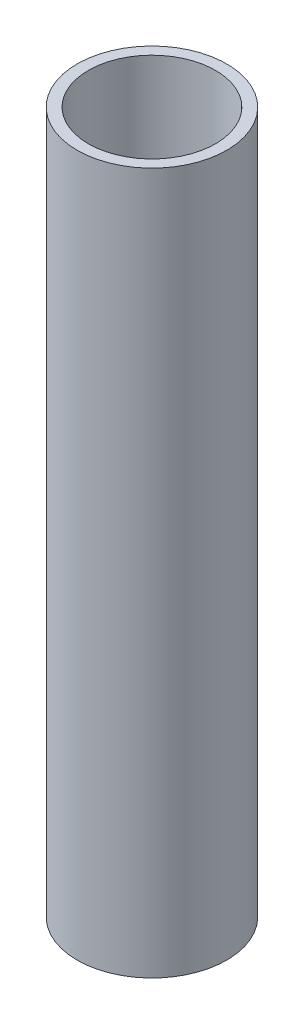
ISO-10303-21;
HEADER;
FILE_DESCRIPTION(('STEP AP214'),'2;1');
FILE_NAME('part.step','',(''),(''),'','','');
FILE_SCHEMA(('AUTOMOTIVE_DESIGN { 1 0 10303 214 1 1 1 1 }'));
ENDSEC;
DATA;
#1=APPLICATION_CONTEXT('core data for automotive mechanical design processes');
#2=APPLICATION_PROTOCOL_DEFINITION('international standard','automotive_design',2000,#1);
#3=PRODUCT_CONTEXT('',#1,'mechanical');
#4=PRODUCT('Part','Part','',(#3));
#5=PRODUCT_RELATED_PRODUCT_CATEGORY('part','',(#4));
#6=PRODUCT_DEFINITION_FORMATION('','',#4);
#7=PRODUCT_DEFINITION_CONTEXT('part definition',#1,'design');
#8=PRODUCT_DEFINITION('design','',#6,#7);
#9=PRODUCT_DEFINITION_SHAPE('','',#8);
#10=(LENGTH_UNIT() NAMED_UNIT(*) SI_UNIT(.MILLI.,.METRE.));
#11=(NAMED_UNIT(*) PLANE_ANGLE_UNIT() SI_UNIT($,.RADIAN.));
#12=(NAMED_UNIT(*) SI_UNIT($,.STERADIAN.) SOLID_ANGLE_UNIT());
#13=UNCERTAINTY_MEASURE_WITH_UNIT(LENGTH_MEASURE(1.E-05),#10,'distance_accuracy_value','');
#14=(GEOMETRIC_REPRESENTATION_CONTEXT(3) GLOBAL_UNCERTAINTY_ASSIGNED_CONTEXT((#13)) GLOBAL_UNIT_ASSIGNED_CONTEXT((#10,
#11,#12)) REPRESENTATION_CONTEXT('',''));
#15=CARTESIAN_POINT('',(0.,0.,0.));
#16=DIRECTION('',(0.,0.,1.));
#17=DIRECTION('',(1.,0.,0.));
#18=AXIS2_PLACEMENT_3D('',#15,#16,#17);
#19=CARTESIAN_POINT('',(0.,150.,0.));
#20=DIRECTION('',(0.,1.,0.));
#21=DIRECTION('',(0.,0.,1.));
#22=AXIS2_PLACEMENT_3D('',#19,#20,#21);
#23=PLANE('',#22);
#24=CARTESIAN_POINT('',(0.,150.,0.));
#25=DIRECTION('',(0.,1.,0.));
#26=DIRECTION('',(0.,0.,1.));
#27=AXIS2_PLACEMENT_3D('',#24,#25,#26);
#28=CIRCLE('',#27,16.);
#29=CARTESIAN_POINT('',(0.,150.,16.));
#30=VERTEX_POINT('',#29);
#31=EDGE_CURVE('E10',#30,#30,#28,.T.);
#32=ORIENTED_EDGE('',*,*,#31,.T.);
#33=EDGE_LOOP('',(#32));
#34=FACE_BOUND('',#33,.T.);
#35=CARTESIAN_POINT('',(0.,150.,0.));
#36=DIRECTION('',(0.,1.,0.));
#37=DIRECTION('',(0.,0.,1.));
#38=AXIS2_PLACEMENT_3D('',#35,#36,#37);
#39=CIRCLE('',#38,13.6);
#40=CARTESIAN_POINT('',(0.,150.,13.6));
#41=VERTEX_POINT('',#40);
#42=EDGE_CURVE('E50',#41,#41,#39,.T.);
#43=ORIENTED_EDGE('',*,*,#42,.F.);
#44=EDGE_LOOP('',(#43));
#45=FACE_BOUND('',#44,.T.);
#46=ADVANCED_FACE('F39',(#34,#45),#23,.T.);
#47=CARTESIAN_POINT('',(0.,0.,0.));
#48=DIRECTION('',(0.,1.,0.));
#49=DIRECTION('',(0.,0.,1.));
#50=AXIS2_PLACEMENT_3D('',#47,#48,#49);
#51=PLANE('',#50);
#52=CARTESIAN_POINT('',(0.,0.,0.));
#53=DIRECTION('',(0.,1.,0.));
#54=DIRECTION('',(0.,0.,1.));
#55=AXIS2_PLACEMENT_3D('',#52,#53,#54);
#56=CIRCLE('',#55,16.);
#57=CARTESIAN_POINT('',(0.,0.,16.));
#58=VERTEX_POINT('',#57);
#59=EDGE_CURVE('E43',#58,#58,#56,.T.);
#60=ORIENTED_EDGE('',*,*,#59,.F.);
#61=EDGE_LOOP('',(#60));
#62=FACE_BOUND('',#61,.T.);
#63=CARTESIAN_POINT('',(0.,0.,0.));
#64=DIRECTION('',(0.,1.,0.));
#65=DIRECTION('',(0.,0.,1.));
#66=AXIS2_PLACEMENT_3D('',#63,#64,#65);
#67=CIRCLE('',#66,13.6);
#68=CARTESIAN_POINT('',(0.,0.,13.6));
#69=VERTEX_POINT('',#68);
#70=EDGE_CURVE('E52',#69,#69,#67,.T.);
#71=ORIENTED_EDGE('',*,*,#70,.T.);
#72=EDGE_LOOP('',(#71));
#73=FACE_BOUND('',#72,.T.);
#74=ADVANCED_FACE('F62',(#62,#73),#51,.F.);
#75=CARTESIAN_POINT('',(0.,150.,0.));
#76=DIRECTION('',(0.,-1.,0.));
#77=DIRECTION('',(0.,0.,-1.));
#78=AXIS2_PLACEMENT_3D('',#75,#76,#77);
#79=CYLINDRICAL_SURFACE('',#78,16.);
#80=ORIENTED_EDGE('',*,*,#31,.F.);
#81=EDGE_LOOP('',(#80));
#82=FACE_BOUND('',#81,.T.);
#83=ORIENTED_EDGE('',*,*,#59,.T.);
#84=EDGE_LOOP('',(#83));
#85=FACE_BOUND('',#84,.T.);
#86=ADVANCED_FACE('F41',(#82,#85),#79,.T.);
#87=CARTESIAN_POINT('',(0.,150.,0.));
#88=DIRECTION('',(0.,-1.,0.));
#89=DIRECTION('',(0.,0.,-1.));
#90=AXIS2_PLACEMENT_3D('',#87,#88,#89);
#91=CYLINDRICAL_SURFACE('',#90,13.6);
#92=ORIENTED_EDGE('',*,*,#42,.T.);
#93=EDGE_LOOP('',(#92));
#94=FACE_BOUND('',#93,.T.);
#95=ORIENTED_EDGE('',*,*,#70,.F.);
#96=EDGE_LOOP('',(#95));
#97=FACE_BOUND('',#96,.T.);
#98=ADVANCED_FACE('F58',(#94,#97),#91,.F.);
#99=CLOSED_SHELL('',(#46,#74,#86,#98));
#100=MANIFOLD_SOLID_BREP('B2',#99);
#101=ADVANCED_BREP_SHAPE_REPRESENTATION('',(#18,#100),#14);
#102=SHAPE_DEFINITION_REPRESENTATION(#9,#101);
ENDSEC;
END-ISO-10303-21;
